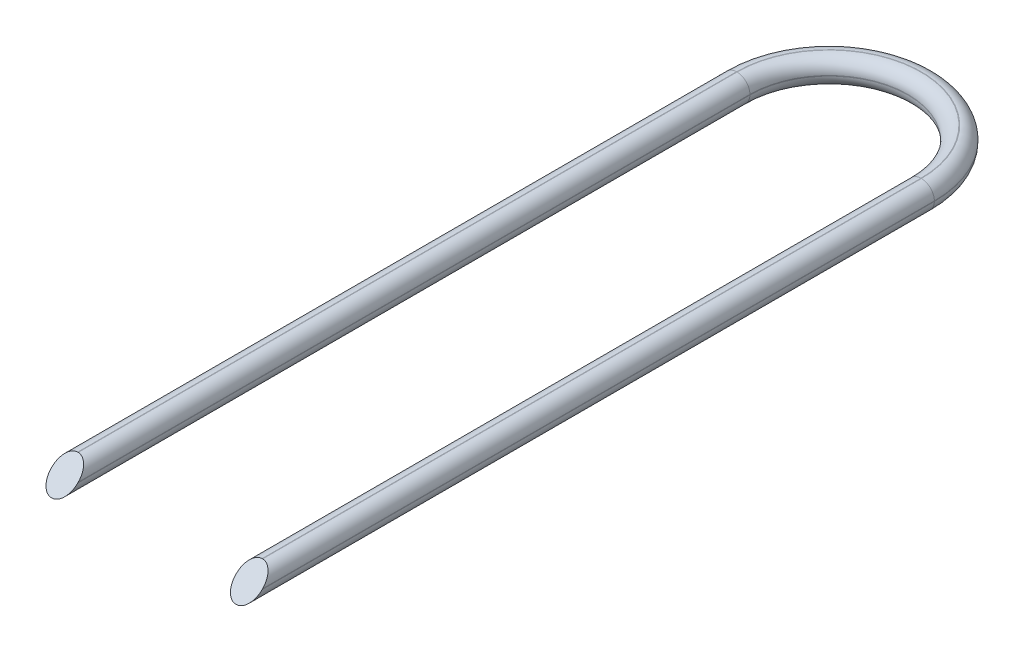
ISO-10303-21;
HEADER;
FILE_DESCRIPTION(('STEP AP214'),'2;1');
FILE_NAME('part.step','',(''),(''),'','','');
FILE_SCHEMA(('AUTOMOTIVE_DESIGN { 1 0 10303 214 1 1 1 1 }'));
ENDSEC;
DATA;
#1=APPLICATION_CONTEXT('core data for automotive mechanical design processes');
#2=APPLICATION_PROTOCOL_DEFINITION('international standard','automotive_design',2000,#1);
#3=PRODUCT_CONTEXT('',#1,'mechanical');
#4=PRODUCT('Part','Part','',(#3));
#5=PRODUCT_RELATED_PRODUCT_CATEGORY('part','',(#4));
#6=PRODUCT_DEFINITION_FORMATION('','',#4);
#7=PRODUCT_DEFINITION_CONTEXT('part definition',#1,'design');
#8=PRODUCT_DEFINITION('design','',#6,#7);
#9=PRODUCT_DEFINITION_SHAPE('','',#8);
#10=(LENGTH_UNIT() NAMED_UNIT(*) SI_UNIT(.MILLI.,.METRE.));
#11=(NAMED_UNIT(*) PLANE_ANGLE_UNIT() SI_UNIT($,.RADIAN.));
#12=(NAMED_UNIT(*) SI_UNIT($,.STERADIAN.) SOLID_ANGLE_UNIT());
#13=UNCERTAINTY_MEASURE_WITH_UNIT(LENGTH_MEASURE(1.E-05),#10,'distance_accuracy_value','');
#14=(GEOMETRIC_REPRESENTATION_CONTEXT(3) GLOBAL_UNCERTAINTY_ASSIGNED_CONTEXT((#13)) GLOBAL_UNIT_ASSIGNED_CONTEXT((#10,
#11,#12)) REPRESENTATION_CONTEXT('',''));
#15=CARTESIAN_POINT('',(0.,0.,0.));
#16=DIRECTION('',(0.,0.,1.));
#17=DIRECTION('',(1.,0.,0.));
#18=AXIS2_PLACEMENT_3D('',#15,#16,#17);
#19=CARTESIAN_POINT('',(18.4463009391175,-1.95817458881617,0.));
#20=DIRECTION('',(1.,0.,0.));
#21=DIRECTION('',(0.,0.,-1.));
#22=AXIS2_PLACEMENT_3D('',#19,#20,#21);
#23=PLANE('',#22);
#24=DIRECTION('',(0.,-0.707106781186548,0.707106781186547));
#25=VECTOR('',#24,1.);
#26=CARTESIAN_POINT('',(18.4463009391175,0.491825411183827,-5.));
#27=LINE('',#26,#25);
#28=CARTESIAN_POINT('',(18.4463009391175,-1.95817458881617,-2.55));
#29=VERTEX_POINT('',#28);
#30=CARTESIAN_POINT('',(18.4463009391175,-2.05817458881617,-2.45));
#31=VERTEX_POINT('',#30);
#32=EDGE_CURVE('E49',#29,#31,#27,.T.);
#33=ORIENTED_EDGE('',*,*,#32,.T.);
#34=DIRECTION('',(0.,0.,-1.));
#35=VECTOR('',#34,1.);
#36=CARTESIAN_POINT('',(18.4463009391175,-2.05817458881617,0.));
#37=LINE('',#36,#35);
#38=CARTESIAN_POINT('',(18.4463009391174,-2.05817458881617,-130.));
#39=VERTEX_POINT('',#38);
#40=EDGE_CURVE('E171',#31,#39,#37,.T.);
#41=ORIENTED_EDGE('',*,*,#40,.T.);
#42=DIRECTION('',(0.,-1.,0.));
#43=VECTOR('',#42,1.);
#44=CARTESIAN_POINT('',(18.4463009391174,-1.95817458881617,-130.));
#45=LINE('',#44,#43);
#46=CARTESIAN_POINT('',(18.4463009391174,-1.95817458881617,-130.));
#47=VERTEX_POINT('',#46);
#48=EDGE_CURVE('E273',#47,#39,#45,.T.);
#49=ORIENTED_EDGE('',*,*,#48,.F.);
#50=DIRECTION('',(0.,0.,-1.));
#51=VECTOR('',#50,1.);
#52=CARTESIAN_POINT('',(18.4463009391175,-1.95817458881617,0.));
#53=LINE('',#52,#51);
#54=EDGE_CURVE('E189',#29,#47,#53,.T.);
#55=ORIENTED_EDGE('',*,*,#54,.F.);
#56=EDGE_LOOP('',(#33,#41,#49,#55));
#57=FACE_BOUND('',#56,.T.);
#58=ADVANCED_FACE('F34',(#57),#23,.T.);
#59=CARTESIAN_POINT('',(15.9963009391175,-2.05817458881617,0.));
#60=DIRECTION('',(0.,0.,-1.));
#61=DIRECTION('',(-1.,0.,0.));
#62=AXIS2_PLACEMENT_3D('',#59,#60,#61);
#63=CYLINDRICAL_SURFACE('',#62,2.45);
#64=CARTESIAN_POINT('',(15.9963009391175,-2.05817458881617,-2.45));
#65=DIRECTION('',(0.,-0.707106781186547,-0.707106781186548));
#66=DIRECTION('',(0.,0.707106781186548,-0.707106781186547));
#67=AXIS2_PLACEMENT_3D('',#64,#65,#66);
#68=ELLIPSE('',#67,3.46482322781408,2.45);
#69=CARTESIAN_POINT('',(15.9963009391175,-4.50817458881617,0.));
#70=VERTEX_POINT('',#69);
#71=EDGE_CURVE('E190',#70,#31,#68,.F.);
#72=ORIENTED_EDGE('',*,*,#71,.F.);
#73=DIRECTION('',(0.,0.,-1.));
#74=VECTOR('',#73,1.);
#75=CARTESIAN_POINT('',(15.9963009391175,-4.50817458881617,0.));
#76=LINE('',#75,#74);
#77=CARTESIAN_POINT('',(15.9963009391174,-4.50817458881617,-130.));
#78=VERTEX_POINT('',#77);
#79=EDGE_CURVE('E170',#70,#78,#76,.T.);
#80=ORIENTED_EDGE('',*,*,#79,.T.);
#81=CARTESIAN_POINT('',(15.9963009391174,-2.05817458881617,-130.));
#82=DIRECTION('',(0.,0.,-1.));
#83=DIRECTION('',(-1.,0.,0.));
#84=AXIS2_PLACEMENT_3D('',#81,#82,#83);
#85=CIRCLE('',#84,2.45);
#86=EDGE_CURVE('E167',#39,#78,#85,.T.);
#87=ORIENTED_EDGE('',*,*,#86,.F.);
#88=ORIENTED_EDGE('',*,*,#40,.F.);
#89=EDGE_LOOP('',(#72,#80,#87,#88));
#90=FACE_BOUND('',#89,.T.);
#91=ADVANCED_FACE('F303',(#90),#63,.T.);
#92=CARTESIAN_POINT('',(15.9963009391175,-4.50817458881617,0.));
#93=DIRECTION('',(0.,-1.,0.));
#94=DIRECTION('',(1.,0.,0.));
#95=AXIS2_PLACEMENT_3D('',#92,#93,#94);
#96=PLANE('',#95);
#97=DIRECTION('',(0.,0.,-1.));
#98=VECTOR('',#97,1.);
#99=CARTESIAN_POINT('',(15.8963009391175,-4.50817458881617,0.));
#100=LINE('',#99,#98);
#101=CARTESIAN_POINT('',(15.8963009391175,-4.50817458881617,0.));
#102=VERTEX_POINT('',#101);
#103=CARTESIAN_POINT('',(15.8963009391174,-4.50817458881617,-130.));
#104=VERTEX_POINT('',#103);
#105=EDGE_CURVE('E193',#102,#104,#100,.T.);
#106=ORIENTED_EDGE('',*,*,#105,.T.);
#107=DIRECTION('',(-1.,0.,0.));
#108=VECTOR('',#107,1.);
#109=CARTESIAN_POINT('',(15.9963009391174,-4.50817458881617,-130.));
#110=LINE('',#109,#108);
#111=EDGE_CURVE('E174',#78,#104,#110,.T.);
#112=ORIENTED_EDGE('',*,*,#111,.F.);
#113=ORIENTED_EDGE('',*,*,#79,.F.);
#114=DIRECTION('',(-1.,0.,0.));
#115=VECTOR('',#114,1.);
#116=CARTESIAN_POINT('',(15.9963009391175,-4.50817458881617,0.));
#117=LINE('',#116,#115);
#118=EDGE_CURVE('E186',#70,#102,#117,.T.);
#119=ORIENTED_EDGE('',*,*,#118,.T.);
#120=EDGE_LOOP('',(#106,#112,#113,#119));
#121=FACE_BOUND('',#120,.T.);
#122=ADVANCED_FACE('F328',(#121),#96,.T.);
#123=CARTESIAN_POINT('',(15.8963009391175,-2.05817458881617,0.));
#124=DIRECTION('',(0.,0.,-1.));
#125=DIRECTION('',(-1.,0.,0.));
#126=AXIS2_PLACEMENT_3D('',#123,#124,#125);
#127=CYLINDRICAL_SURFACE('',#126,2.45);
#128=CARTESIAN_POINT('',(15.8963009391175,-2.05817458881617,-2.45));
#129=DIRECTION('',(0.,-0.707106781186547,-0.707106781186548));
#130=DIRECTION('',(0.,0.707106781186548,-0.707106781186547));
#131=AXIS2_PLACEMENT_3D('',#128,#129,#130);
#132=ELLIPSE('',#131,3.46482322781408,2.45);
#133=CARTESIAN_POINT('',(13.4463009391175,-2.05817458881617,-2.45));
#134=VERTEX_POINT('',#133);
#135=EDGE_CURVE('E278',#134,#102,#132,.F.);
#136=ORIENTED_EDGE('',*,*,#135,.F.);
#137=DIRECTION('',(0.,0.,-1.));
#138=VECTOR('',#137,1.);
#139=CARTESIAN_POINT('',(13.4463009391175,-2.05817458881617,0.));
#140=LINE('',#139,#138);
#141=CARTESIAN_POINT('',(13.4463009391175,-2.05817458881617,-130.));
#142=VERTEX_POINT('',#141);
#143=EDGE_CURVE('E210',#134,#142,#140,.T.);
#144=ORIENTED_EDGE('',*,*,#143,.T.);
#145=CARTESIAN_POINT('',(15.8963009391174,-2.05817458881617,-130.));
#146=DIRECTION('',(0.,0.,-1.));
#147=DIRECTION('',(-1.,0.,0.));
#148=AXIS2_PLACEMENT_3D('',#145,#146,#147);
#149=CIRCLE('',#148,2.45);
#150=EDGE_CURVE('E196',#104,#142,#149,.T.);
#151=ORIENTED_EDGE('',*,*,#150,.F.);
#152=ORIENTED_EDGE('',*,*,#105,.F.);
#153=EDGE_LOOP('',(#136,#144,#151,#152));
#154=FACE_BOUND('',#153,.T.);
#155=ADVANCED_FACE('F332',(#154),#127,.T.);
#156=CARTESIAN_POINT('',(13.4463009391175,-1.95817458881617,0.));
#157=DIRECTION('',(-1.,0.,0.));
#158=DIRECTION('',(0.,0.,1.));
#159=AXIS2_PLACEMENT_3D('',#156,#157,#158);
#160=PLANE('',#159);
#161=DIRECTION('',(0.,-0.707106781186548,0.707106781186547));
#162=VECTOR('',#161,1.);
#163=CARTESIAN_POINT('',(13.4463009391175,-3.23317458881617,-1.275));
#164=LINE('',#163,#162);
#165=CARTESIAN_POINT('',(13.4463009391175,-1.95817458881617,-2.55));
#166=VERTEX_POINT('',#165);
#167=EDGE_CURVE('E280',#166,#134,#164,.T.);
#168=ORIENTED_EDGE('',*,*,#167,.F.);
#169=DIRECTION('',(0.,0.,-1.));
#170=VECTOR('',#169,1.);
#171=CARTESIAN_POINT('',(13.4463009391175,-1.95817458881617,0.));
#172=LINE('',#171,#170);
#173=CARTESIAN_POINT('',(13.4463009391174,-1.95817458881617,-130.));
#174=VERTEX_POINT('',#173);
#175=EDGE_CURVE('E224',#166,#174,#172,.T.);
#176=ORIENTED_EDGE('',*,*,#175,.T.);
#177=DIRECTION('',(0.,1.,0.));
#178=VECTOR('',#177,1.);
#179=CARTESIAN_POINT('',(13.4463009391175,-1.95817458881617,-130.));
#180=LINE('',#179,#178);
#181=EDGE_CURVE('E212',#142,#174,#180,.T.);
#182=ORIENTED_EDGE('',*,*,#181,.F.);
#183=ORIENTED_EDGE('',*,*,#143,.F.);
#184=EDGE_LOOP('',(#168,#176,#182,#183));
#185=FACE_BOUND('',#184,.T.);
#186=ADVANCED_FACE('F340',(#185),#160,.T.);
#187=CARTESIAN_POINT('',(15.8963009391175,-1.95817458881617,0.));
#188=DIRECTION('',(0.,0.,-1.));
#189=DIRECTION('',(-1.,0.,0.));
#190=AXIS2_PLACEMENT_3D('',#187,#188,#189);
#191=CYLINDRICAL_SURFACE('',#190,2.45);
#192=CARTESIAN_POINT('',(15.8963009391175,-1.95817458881617,-2.55));
#193=DIRECTION('',(0.,-0.707106781186547,-0.707106781186548));
#194=DIRECTION('',(0.,0.707106781186548,-0.707106781186547));
#195=AXIS2_PLACEMENT_3D('',#192,#193,#194);
#196=ELLIPSE('',#195,3.46482322781408,2.45);
#197=CARTESIAN_POINT('',(15.8963009391174,0.491825411183827,-5.));
#198=VERTEX_POINT('',#197);
#199=EDGE_CURVE('E282',#198,#166,#196,.F.);
#200=ORIENTED_EDGE('',*,*,#199,.F.);
#201=DIRECTION('',(0.,0.,-1.));
#202=VECTOR('',#201,1.);
#203=CARTESIAN_POINT('',(15.8963009391175,0.491825411183827,0.));
#204=LINE('',#203,#202);
#205=CARTESIAN_POINT('',(15.8963009391174,0.491825411183827,-130.));
#206=VERTEX_POINT('',#205);
#207=EDGE_CURVE('E238',#198,#206,#204,.T.);
#208=ORIENTED_EDGE('',*,*,#207,.T.);
#209=CARTESIAN_POINT('',(15.8963009391174,-1.95817458881617,-130.));
#210=DIRECTION('',(0.,0.,-1.));
#211=DIRECTION('',(-1.,0.,0.));
#212=AXIS2_PLACEMENT_3D('',#209,#210,#211);
#213=CIRCLE('',#212,2.45);
#214=EDGE_CURVE('E226',#174,#206,#213,.T.);
#215=ORIENTED_EDGE('',*,*,#214,.F.);
#216=ORIENTED_EDGE('',*,*,#175,.F.);
#217=EDGE_LOOP('',(#200,#208,#215,#216));
#218=FACE_BOUND('',#217,.T.);
#219=ADVANCED_FACE('F349',(#218),#191,.T.);
#220=CARTESIAN_POINT('',(15.9963009391175,0.491825411183827,0.));
#221=DIRECTION('',(0.,1.,0.));
#222=DIRECTION('',(0.,0.,1.));
#223=AXIS2_PLACEMENT_3D('',#220,#221,#222);
#224=PLANE('',#223);
#225=DIRECTION('',(-1.,0.,0.));
#226=VECTOR('',#225,1.);
#227=CARTESIAN_POINT('',(18.4463009391175,0.491825411183827,-5.));
#228=LINE('',#227,#226);
#229=CARTESIAN_POINT('',(15.9963009391175,0.491825411183827,-5.));
#230=VERTEX_POINT('',#229);
#231=EDGE_CURVE('E294',#230,#198,#228,.T.);
#232=ORIENTED_EDGE('',*,*,#231,.F.);
#233=DIRECTION('',(0.,0.,-1.));
#234=VECTOR('',#233,1.);
#235=CARTESIAN_POINT('',(15.9963009391175,0.491825411183827,0.));
#236=LINE('',#235,#234);
#237=CARTESIAN_POINT('',(15.9963009391174,0.491825411183827,-130.));
#238=VERTEX_POINT('',#237);
#239=EDGE_CURVE('E251',#230,#238,#236,.T.);
#240=ORIENTED_EDGE('',*,*,#239,.T.);
#241=DIRECTION('',(1.,0.,0.));
#242=VECTOR('',#241,1.);
#243=CARTESIAN_POINT('',(15.9963009391174,0.491825411183827,-130.));
#244=LINE('',#243,#242);
#245=EDGE_CURVE('E240',#206,#238,#244,.T.);
#246=ORIENTED_EDGE('',*,*,#245,.F.);
#247=ORIENTED_EDGE('',*,*,#207,.F.);
#248=EDGE_LOOP('',(#232,#240,#246,#247));
#249=FACE_BOUND('',#248,.T.);
#250=ADVANCED_FACE('F358',(#249),#224,.T.);
#251=CARTESIAN_POINT('',(15.9963009391175,-1.95817458881617,0.));
#252=DIRECTION('',(0.,0.,-1.));
#253=DIRECTION('',(-1.,0.,0.));
#254=AXIS2_PLACEMENT_3D('',#251,#252,#253);
#255=CYLINDRICAL_SURFACE('',#254,2.45);
#256=CARTESIAN_POINT('',(15.9963009391175,-1.95817458881617,-2.55));
#257=DIRECTION('',(0.,-0.707106781186547,-0.707106781186548));
#258=DIRECTION('',(0.,0.707106781186548,-0.707106781186547));
#259=AXIS2_PLACEMENT_3D('',#256,#257,#258);
#260=ELLIPSE('',#259,3.46482322781408,2.45);
#261=EDGE_CURVE('E284',#29,#230,#260,.F.);
#262=ORIENTED_EDGE('',*,*,#261,.F.);
#263=ORIENTED_EDGE('',*,*,#54,.T.);
#264=CARTESIAN_POINT('',(15.9963009391174,-1.95817458881617,-130.));
#265=DIRECTION('',(0.,0.,-1.));
#266=DIRECTION('',(1.,0.,0.));
#267=AXIS2_PLACEMENT_3D('',#264,#265,#266);
#268=CIRCLE('',#267,2.45);
#269=EDGE_CURVE('E253',#238,#47,#268,.T.);
#270=ORIENTED_EDGE('',*,*,#269,.F.);
#271=ORIENTED_EDGE('',*,*,#239,.F.);
#272=EDGE_LOOP('',(#262,#263,#270,#271));
#273=FACE_BOUND('',#272,.T.);
#274=ADVANCED_FACE('F362',(#273),#255,.T.);
#275=CARTESIAN_POINT('',(-1.55369906088255,0.,-130.));
#276=DIRECTION('',(0.,1.,0.));
#277=DIRECTION('',(0.,0.,1.));
#278=AXIS2_PLACEMENT_3D('',#275,#276,#277);
#279=CYLINDRICAL_SURFACE('',#278,20.);
#280=CARTESIAN_POINT('',(-1.55369906088255,-2.05817458881617,-130.));
#281=DIRECTION('',(0.,1.,0.));
#282=DIRECTION('',(1.,0.,0.));
#283=AXIS2_PLACEMENT_3D('',#280,#281,#282);
#284=CIRCLE('',#283,20.);
#285=CARTESIAN_POINT('',(-21.5536990608825,-2.05817458881617,-130.));
#286=VERTEX_POINT('',#285);
#287=EDGE_CURVE('E179',#39,#286,#284,.T.);
#288=ORIENTED_EDGE('',*,*,#287,.T.);
#289=DIRECTION('',(0.,-1.,0.));
#290=VECTOR('',#289,1.);
#291=CARTESIAN_POINT('',(-21.5536990608825,-1.95817458881617,-130.));
#292=LINE('',#291,#290);
#293=CARTESIAN_POINT('',(-21.5536990608825,-1.95817458881617,-130.));
#294=VERTEX_POINT('',#293);
#295=EDGE_CURVE('E266',#294,#286,#292,.T.);
#296=ORIENTED_EDGE('',*,*,#295,.F.);
#297=CARTESIAN_POINT('',(-1.55369906088255,-1.95817458881617,-130.));
#298=DIRECTION('',(0.,1.,0.));
#299=DIRECTION('',(1.,0.,0.));
#300=AXIS2_PLACEMENT_3D('',#297,#298,#299);
#301=CIRCLE('',#300,20.);
#302=EDGE_CURVE('E260',#47,#294,#301,.T.);
#303=ORIENTED_EDGE('',*,*,#302,.F.);
#304=ORIENTED_EDGE('',*,*,#48,.T.);
#305=EDGE_LOOP('',(#288,#296,#303,#304));
#306=FACE_BOUND('',#305,.T.);
#307=ADVANCED_FACE('F307',(#306),#279,.T.);
#308=CARTESIAN_POINT('',(-1.55369906088255,-2.05817458881617,-130.));
#309=DIRECTION('',(0.,1.,0.));
#310=DIRECTION('',(0.,0.,1.));
#311=AXIS2_PLACEMENT_3D('',#308,#309,#310);
#312=TOROIDAL_SURFACE('',#311,17.55,2.45);
#313=CARTESIAN_POINT('',(-1.55369906088255,-4.50817458881617,-130.));
#314=DIRECTION('',(0.,1.,0.));
#315=DIRECTION('',(1.,0.,0.));
#316=AXIS2_PLACEMENT_3D('',#313,#314,#315);
#317=CIRCLE('',#316,17.55);
#318=CARTESIAN_POINT('',(-19.1036990608825,-4.50817458881617,-130.));
#319=VERTEX_POINT('',#318);
#320=EDGE_CURVE('E178',#78,#319,#317,.T.);
#321=ORIENTED_EDGE('',*,*,#320,.T.);
#322=CARTESIAN_POINT('',(-19.1036990608825,-2.05817458881617,-130.));
#323=DIRECTION('',(0.,0.,1.));
#324=DIRECTION('',(1.,0.,0.));
#325=AXIS2_PLACEMENT_3D('',#322,#323,#324);
#326=CIRCLE('',#325,2.45);
#327=EDGE_CURVE('E175',#286,#319,#326,.T.);
#328=ORIENTED_EDGE('',*,*,#327,.F.);
#329=ORIENTED_EDGE('',*,*,#287,.F.);
#330=ORIENTED_EDGE('',*,*,#86,.T.);
#331=EDGE_LOOP('',(#321,#328,#329,#330));
#332=FACE_BOUND('',#331,.T.);
#333=ADVANCED_FACE('F309',(#332),#312,.T.);
#334=CARTESIAN_POINT('',(15.9963009391174,-4.50817458881617,-130.));
#335=DIRECTION('',(0.,-1.,0.));
#336=DIRECTION('',(0.,0.,-1.));
#337=AXIS2_PLACEMENT_3D('',#334,#335,#336);
#338=PLANE('',#337);
#339=CARTESIAN_POINT('',(-1.55369906088255,-4.50817458881617,-130.));
#340=DIRECTION('',(0.,1.,0.));
#341=DIRECTION('',(1.,0.,0.));
#342=AXIS2_PLACEMENT_3D('',#339,#340,#341);
#343=CIRCLE('',#342,17.45);
#344=CARTESIAN_POINT('',(-19.0036990608825,-4.50817458881617,-130.));
#345=VERTEX_POINT('',#344);
#346=EDGE_CURVE('E199',#104,#345,#343,.T.);
#347=ORIENTED_EDGE('',*,*,#346,.T.);
#348=DIRECTION('',(1.,0.,0.));
#349=VECTOR('',#348,1.);
#350=CARTESIAN_POINT('',(-19.1036990608825,-4.50817458881617,-130.));
#351=LINE('',#350,#349);
#352=EDGE_CURVE('E182',#319,#345,#351,.T.);
#353=ORIENTED_EDGE('',*,*,#352,.F.);
#354=ORIENTED_EDGE('',*,*,#320,.F.);
#355=ORIENTED_EDGE('',*,*,#111,.T.);
#356=EDGE_LOOP('',(#347,#353,#354,#355));
#357=FACE_BOUND('',#356,.T.);
#358=ADVANCED_FACE('F325',(#357),#338,.T.);
#359=CARTESIAN_POINT('',(-1.55369906088255,-2.05817458881617,-130.));
#360=DIRECTION('',(0.,1.,0.));
#361=DIRECTION('',(0.,0.,1.));
#362=AXIS2_PLACEMENT_3D('',#359,#360,#361);
#363=TOROIDAL_SURFACE('',#362,17.45,2.45);
#364=CARTESIAN_POINT('',(-1.55369906088255,-2.05817458881617,-130.));
#365=DIRECTION('',(0.,1.,0.));
#366=DIRECTION('',(1.,0.,0.));
#367=AXIS2_PLACEMENT_3D('',#364,#365,#366);
#368=CIRCLE('',#367,15.);
#369=CARTESIAN_POINT('',(-16.5536990608825,-2.05817458881617,-130.));
#370=VERTEX_POINT('',#369);
#371=EDGE_CURVE('E215',#142,#370,#368,.T.);
#372=ORIENTED_EDGE('',*,*,#371,.T.);
#373=CARTESIAN_POINT('',(-19.0036990608825,-2.05817458881617,-130.));
#374=DIRECTION('',(0.,0.,1.));
#375=DIRECTION('',(1.,0.,0.));
#376=AXIS2_PLACEMENT_3D('',#373,#374,#375);
#377=CIRCLE('',#376,2.45);
#378=EDGE_CURVE('E202',#345,#370,#377,.T.);
#379=ORIENTED_EDGE('',*,*,#378,.F.);
#380=ORIENTED_EDGE('',*,*,#346,.F.);
#381=ORIENTED_EDGE('',*,*,#150,.T.);
#382=EDGE_LOOP('',(#372,#379,#380,#381));
#383=FACE_BOUND('',#382,.T.);
#384=ADVANCED_FACE('F321',(#383),#363,.T.);
#385=CARTESIAN_POINT('',(-1.55369906088255,0.,-130.));
#386=DIRECTION('',(0.,1.,0.));
#387=DIRECTION('',(0.,0.,1.));
#388=AXIS2_PLACEMENT_3D('',#385,#386,#387);
#389=CYLINDRICAL_SURFACE('',#388,15.);
#390=CARTESIAN_POINT('',(-1.55369906088255,-1.95817458881617,-130.));
#391=DIRECTION('',(0.,1.,0.));
#392=DIRECTION('',(1.,0.,0.));
#393=AXIS2_PLACEMENT_3D('',#390,#391,#392);
#394=CIRCLE('',#393,15.);
#395=CARTESIAN_POINT('',(-16.5536990608825,-1.95817458881617,-130.));
#396=VERTEX_POINT('',#395);
#397=EDGE_CURVE('E229',#174,#396,#394,.T.);
#398=ORIENTED_EDGE('',*,*,#397,.T.);
#399=DIRECTION('',(0.,1.,0.));
#400=VECTOR('',#399,1.);
#401=CARTESIAN_POINT('',(-16.5536990608825,-1.95817458881617,-130.));
#402=LINE('',#401,#400);
#403=EDGE_CURVE('E218',#370,#396,#402,.T.);
#404=ORIENTED_EDGE('',*,*,#403,.F.);
#405=ORIENTED_EDGE('',*,*,#371,.F.);
#406=ORIENTED_EDGE('',*,*,#181,.T.);
#407=EDGE_LOOP('',(#398,#404,#405,#406));
#408=FACE_BOUND('',#407,.T.);
#409=ADVANCED_FACE('F339',(#408),#389,.F.);
#410=CARTESIAN_POINT('',(-1.55369906088255,-1.95817458881617,-130.));
#411=DIRECTION('',(0.,1.,0.));
#412=DIRECTION('',(0.,0.,1.));
#413=AXIS2_PLACEMENT_3D('',#410,#411,#412);
#414=TOROIDAL_SURFACE('',#413,17.45,2.45);
#415=CARTESIAN_POINT('',(-1.55369906088255,0.491825411183827,-130.));
#416=DIRECTION('',(0.,1.,0.));
#417=DIRECTION('',(1.,0.,0.));
#418=AXIS2_PLACEMENT_3D('',#415,#416,#417);
#419=CIRCLE('',#418,17.45);
#420=CARTESIAN_POINT('',(-19.0036990608825,0.491825411183827,-130.));
#421=VERTEX_POINT('',#420);
#422=EDGE_CURVE('E243',#206,#421,#419,.T.);
#423=ORIENTED_EDGE('',*,*,#422,.T.);
#424=CARTESIAN_POINT('',(-19.0036990608825,-1.95817458881617,-130.));
#425=DIRECTION('',(0.,0.,1.));
#426=DIRECTION('',(1.,0.,0.));
#427=AXIS2_PLACEMENT_3D('',#424,#425,#426);
#428=CIRCLE('',#427,2.45);
#429=EDGE_CURVE('E232',#396,#421,#428,.T.);
#430=ORIENTED_EDGE('',*,*,#429,.F.);
#431=ORIENTED_EDGE('',*,*,#397,.F.);
#432=ORIENTED_EDGE('',*,*,#214,.T.);
#433=EDGE_LOOP('',(#423,#430,#431,#432));
#434=FACE_BOUND('',#433,.T.);
#435=ADVANCED_FACE('F348',(#434),#414,.T.);
#436=CARTESIAN_POINT('',(15.9963009391174,0.491825411183827,-130.));
#437=DIRECTION('',(0.,1.,0.));
#438=DIRECTION('',(0.,0.,1.));
#439=AXIS2_PLACEMENT_3D('',#436,#437,#438);
#440=PLANE('',#439);
#441=CARTESIAN_POINT('',(-1.55369906088255,0.491825411183827,-130.));
#442=DIRECTION('',(0.,1.,0.));
#443=DIRECTION('',(1.,0.,0.));
#444=AXIS2_PLACEMENT_3D('',#441,#442,#443);
#445=CIRCLE('',#444,17.55);
#446=CARTESIAN_POINT('',(-19.1036990608825,0.491825411183827,-130.));
#447=VERTEX_POINT('',#446);
#448=EDGE_CURVE('E164',#238,#447,#445,.T.);
#449=ORIENTED_EDGE('',*,*,#448,.T.);
#450=DIRECTION('',(-1.,0.,0.));
#451=VECTOR('',#450,1.);
#452=CARTESIAN_POINT('',(-19.1036990608825,0.491825411183827,-130.));
#453=LINE('',#452,#451);
#454=EDGE_CURVE('E246',#421,#447,#453,.T.);
#455=ORIENTED_EDGE('',*,*,#454,.F.);
#456=ORIENTED_EDGE('',*,*,#422,.F.);
#457=ORIENTED_EDGE('',*,*,#245,.T.);
#458=EDGE_LOOP('',(#449,#455,#456,#457));
#459=FACE_BOUND('',#458,.T.);
#460=ADVANCED_FACE('F357',(#459),#440,.T.);
#461=CARTESIAN_POINT('',(-1.55369906088255,-1.95817458881617,-130.));
#462=DIRECTION('',(0.,1.,0.));
#463=DIRECTION('',(0.,0.,1.));
#464=AXIS2_PLACEMENT_3D('',#461,#462,#463);
#465=TOROIDAL_SURFACE('',#464,17.55,2.45);
#466=CARTESIAN_POINT('',(-19.1036990608825,-1.95817458881617,-130.));
#467=DIRECTION('',(0.,0.,1.));
#468=DIRECTION('',(-1.,0.,0.));
#469=AXIS2_PLACEMENT_3D('',#466,#467,#468);
#470=CIRCLE('',#469,2.45);
#471=EDGE_CURVE('E159',#447,#294,#470,.T.);
#472=ORIENTED_EDGE('',*,*,#471,.F.);
#473=ORIENTED_EDGE('',*,*,#448,.F.);
#474=ORIENTED_EDGE('',*,*,#269,.T.);
#475=ORIENTED_EDGE('',*,*,#302,.T.);
#476=EDGE_LOOP('',(#472,#473,#474,#475));
#477=FACE_BOUND('',#476,.T.);
#478=ADVANCED_FACE('F361',(#477),#465,.T.);
#479=CARTESIAN_POINT('',(-21.5536990608825,-1.95817458881617,-130.));
#480=DIRECTION('',(-1.,0.,0.));
#481=DIRECTION('',(0.,0.,1.));
#482=AXIS2_PLACEMENT_3D('',#479,#480,#481);
#483=PLANE('',#482);
#484=DIRECTION('',(0.,-0.707106781186548,0.707106781186547));
#485=VECTOR('',#484,1.);
#486=CARTESIAN_POINT('',(-21.5536990608825,0.491825411183827,-5.));
#487=LINE('',#486,#485);
#488=CARTESIAN_POINT('',(-21.5536990608825,-1.95817458881617,-2.55));
#489=VERTEX_POINT('',#488);
#490=CARTESIAN_POINT('',(-21.5536990608825,-2.05817458881618,-2.45));
#491=VERTEX_POINT('',#490);
#492=EDGE_CURVE('E145',#489,#491,#487,.T.);
#493=ORIENTED_EDGE('',*,*,#492,.F.);
#494=DIRECTION('',(0.,0.,1.));
#495=VECTOR('',#494,1.);
#496=CARTESIAN_POINT('',(-21.5536990608825,-1.95817458881617,-130.));
#497=LINE('',#496,#495);
#498=EDGE_CURVE('E154',#294,#489,#497,.T.);
#499=ORIENTED_EDGE('',*,*,#498,.F.);
#500=ORIENTED_EDGE('',*,*,#295,.T.);
#501=DIRECTION('',(0.,0.,1.));
#502=VECTOR('',#501,1.);
#503=CARTESIAN_POINT('',(-21.5536990608825,-2.05817458881617,-130.));
#504=LINE('',#503,#502);
#505=EDGE_CURVE('E156',#286,#491,#504,.T.);
#506=ORIENTED_EDGE('',*,*,#505,.T.);
#507=EDGE_LOOP('',(#493,#499,#500,#506));
#508=FACE_BOUND('',#507,.T.);
#509=ADVANCED_FACE('F152',(#508),#483,.T.);
#510=CARTESIAN_POINT('',(-19.1036990608825,-2.05817458881617,-130.));
#511=DIRECTION('',(0.,0.,1.));
#512=DIRECTION('',(1.,0.,0.));
#513=AXIS2_PLACEMENT_3D('',#510,#511,#512);
#514=CYLINDRICAL_SURFACE('',#513,2.45);
#515=CARTESIAN_POINT('',(-19.1036990608825,-2.05817458881617,-2.45000000000001));
#516=DIRECTION('',(0.,-0.707106781186547,-0.707106781186548));
#517=DIRECTION('',(0.,-0.707106781186548,0.707106781186547));
#518=AXIS2_PLACEMENT_3D('',#515,#516,#517);
#519=ELLIPSE('',#518,3.46482322781408,2.45);
#520=CARTESIAN_POINT('',(-19.1036990608825,-4.50817458881617,0.));
#521=VERTEX_POINT('',#520);
#522=EDGE_CURVE('E286',#491,#521,#519,.F.);
#523=ORIENTED_EDGE('',*,*,#522,.F.);
#524=ORIENTED_EDGE('',*,*,#505,.F.);
#525=ORIENTED_EDGE('',*,*,#327,.T.);
#526=DIRECTION('',(0.,0.,1.));
#527=VECTOR('',#526,1.);
#528=CARTESIAN_POINT('',(-19.1036990608825,-4.50817458881617,-130.));
#529=LINE('',#528,#527);
#530=EDGE_CURVE('E162',#319,#521,#529,.T.);
#531=ORIENTED_EDGE('',*,*,#530,.T.);
#532=EDGE_LOOP('',(#523,#524,#525,#531));
#533=FACE_BOUND('',#532,.T.);
#534=ADVANCED_FACE('F311',(#533),#514,.T.);
#535=CARTESIAN_POINT('',(-19.1036990608825,-4.50817458881617,-130.));
#536=DIRECTION('',(0.,-1.,0.));
#537=DIRECTION('',(1.,0.,0.));
#538=AXIS2_PLACEMENT_3D('',#535,#536,#537);
#539=PLANE('',#538);
#540=DIRECTION('',(0.,0.,1.));
#541=VECTOR('',#540,1.);
#542=CARTESIAN_POINT('',(-19.0036990608825,-4.50817458881617,-130.));
#543=LINE('',#542,#541);
#544=CARTESIAN_POINT('',(-19.0036990608825,-4.50817458881617,0.));
#545=VERTEX_POINT('',#544);
#546=EDGE_CURVE('E204',#345,#545,#543,.T.);
#547=ORIENTED_EDGE('',*,*,#546,.T.);
#548=DIRECTION('',(1.,0.,0.));
#549=VECTOR('',#548,1.);
#550=CARTESIAN_POINT('',(-19.1036990608825,-4.50817458881617,0.));
#551=LINE('',#550,#549);
#552=EDGE_CURVE('E185',#521,#545,#551,.T.);
#553=ORIENTED_EDGE('',*,*,#552,.F.);
#554=ORIENTED_EDGE('',*,*,#530,.F.);
#555=ORIENTED_EDGE('',*,*,#352,.T.);
#556=EDGE_LOOP('',(#547,#553,#554,#555));
#557=FACE_BOUND('',#556,.T.);
#558=ADVANCED_FACE('F315',(#557),#539,.T.);
#559=CARTESIAN_POINT('',(-19.0036990608825,-2.05817458881617,-130.));
#560=DIRECTION('',(0.,0.,1.));
#561=DIRECTION('',(1.,0.,0.));
#562=AXIS2_PLACEMENT_3D('',#559,#560,#561);
#563=CYLINDRICAL_SURFACE('',#562,2.45);
#564=CARTESIAN_POINT('',(-19.0036990608825,-2.05817458881617,-2.45000000000001));
#565=DIRECTION('',(0.,-0.707106781186547,-0.707106781186548));
#566=DIRECTION('',(0.,-0.707106781186548,0.707106781186547));
#567=AXIS2_PLACEMENT_3D('',#564,#565,#566);
#568=ELLIPSE('',#567,3.46482322781408,2.45);
#569=CARTESIAN_POINT('',(-16.5536990608825,-2.05817458881617,-2.45000000000001));
#570=VERTEX_POINT('',#569);
#571=EDGE_CURVE('E288',#545,#570,#568,.F.);
#572=ORIENTED_EDGE('',*,*,#571,.F.);
#573=ORIENTED_EDGE('',*,*,#546,.F.);
#574=ORIENTED_EDGE('',*,*,#378,.T.);
#575=DIRECTION('',(0.,0.,1.));
#576=VECTOR('',#575,1.);
#577=CARTESIAN_POINT('',(-16.5536990608825,-2.05817458881617,-130.));
#578=LINE('',#577,#576);
#579=EDGE_CURVE('E207',#370,#570,#578,.T.);
#580=ORIENTED_EDGE('',*,*,#579,.T.);
#581=EDGE_LOOP('',(#572,#573,#574,#580));
#582=FACE_BOUND('',#581,.T.);
#583=ADVANCED_FACE('F319',(#582),#563,.T.);
#584=CARTESIAN_POINT('',(-16.5536990608825,-1.95817458881617,-130.));
#585=DIRECTION('',(1.,0.,0.));
#586=DIRECTION('',(0.,0.,-1.));
#587=AXIS2_PLACEMENT_3D('',#584,#585,#586);
#588=PLANE('',#587);
#589=DIRECTION('',(0.,0.707106781186548,-0.707106781186547));
#590=VECTOR('',#589,1.);
#591=CARTESIAN_POINT('',(-16.5536990608825,61.7668254111838,-66.275));
#592=LINE('',#591,#590);
#593=CARTESIAN_POINT('',(-16.5536990608825,-1.95817458881617,-2.55));
#594=VERTEX_POINT('',#593);
#595=EDGE_CURVE('E290',#570,#594,#592,.T.);
#596=ORIENTED_EDGE('',*,*,#595,.F.);
#597=ORIENTED_EDGE('',*,*,#579,.F.);
#598=ORIENTED_EDGE('',*,*,#403,.T.);
#599=DIRECTION('',(0.,0.,1.));
#600=VECTOR('',#599,1.);
#601=CARTESIAN_POINT('',(-16.5536990608825,-1.95817458881617,-130.));
#602=LINE('',#601,#600);
#603=EDGE_CURVE('E221',#396,#594,#602,.T.);
#604=ORIENTED_EDGE('',*,*,#603,.T.);
#605=EDGE_LOOP('',(#596,#597,#598,#604));
#606=FACE_BOUND('',#605,.T.);
#607=ADVANCED_FACE('F381',(#606),#588,.T.);
#608=CARTESIAN_POINT('',(-19.0036990608825,-1.95817458881617,-130.));
#609=DIRECTION('',(0.,0.,1.));
#610=DIRECTION('',(1.,0.,0.));
#611=AXIS2_PLACEMENT_3D('',#608,#609,#610);
#612=CYLINDRICAL_SURFACE('',#611,2.45);
#613=CARTESIAN_POINT('',(-19.0036990608825,-1.95817458881617,-2.55));
#614=DIRECTION('',(0.,-0.707106781186547,-0.707106781186548));
#615=DIRECTION('',(0.,-0.707106781186548,0.707106781186547));
#616=AXIS2_PLACEMENT_3D('',#613,#614,#615);
#617=ELLIPSE('',#616,3.46482322781408,2.45);
#618=CARTESIAN_POINT('',(-19.0036990608825,0.491825411183827,-5.));
#619=VERTEX_POINT('',#618);
#620=EDGE_CURVE('E292',#594,#619,#617,.F.);
#621=ORIENTED_EDGE('',*,*,#620,.F.);
#622=ORIENTED_EDGE('',*,*,#603,.F.);
#623=ORIENTED_EDGE('',*,*,#429,.T.);
#624=DIRECTION('',(0.,0.,1.));
#625=VECTOR('',#624,1.);
#626=CARTESIAN_POINT('',(-19.0036990608825,0.491825411183827,-130.));
#627=LINE('',#626,#625);
#628=EDGE_CURVE('E235',#421,#619,#627,.T.);
#629=ORIENTED_EDGE('',*,*,#628,.T.);
#630=EDGE_LOOP('',(#621,#622,#623,#629));
#631=FACE_BOUND('',#630,.T.);
#632=ADVANCED_FACE('F375',(#631),#612,.T.);
#633=CARTESIAN_POINT('',(-19.1036990608825,0.491825411183827,-130.));
#634=DIRECTION('',(0.,1.,0.));
#635=DIRECTION('',(0.,0.,1.));
#636=AXIS2_PLACEMENT_3D('',#633,#634,#635);
#637=PLANE('',#636);
#638=CARTESIAN_POINT('',(-19.1036990608825,0.491825411183827,-5.));
#639=VERTEX_POINT('',#638);
#640=EDGE_CURVE('E56',#619,#639,#228,.T.);
#641=ORIENTED_EDGE('',*,*,#640,.F.);
#642=ORIENTED_EDGE('',*,*,#628,.F.);
#643=ORIENTED_EDGE('',*,*,#454,.T.);
#644=DIRECTION('',(0.,0.,1.));
#645=VECTOR('',#644,1.);
#646=CARTESIAN_POINT('',(-19.1036990608825,0.491825411183827,-130.));
#647=LINE('',#646,#645);
#648=EDGE_CURVE('E42',#447,#639,#647,.T.);
#649=ORIENTED_EDGE('',*,*,#648,.T.);
#650=EDGE_LOOP('',(#641,#642,#643,#649));
#651=FACE_BOUND('',#650,.T.);
#652=ADVANCED_FACE('F371',(#651),#637,.T.);
#653=CARTESIAN_POINT('',(-19.1036990608825,-1.95817458881617,-130.));
#654=DIRECTION('',(0.,0.,1.));
#655=DIRECTION('',(1.,0.,0.));
#656=AXIS2_PLACEMENT_3D('',#653,#654,#655);
#657=CYLINDRICAL_SURFACE('',#656,2.45);
#658=CARTESIAN_POINT('',(-19.1036990608825,-1.95817458881617,-2.55));
#659=DIRECTION('',(0.,-0.707106781186547,-0.707106781186548));
#660=DIRECTION('',(0.,-0.707106781186548,0.707106781186547));
#661=AXIS2_PLACEMENT_3D('',#658,#659,#660);
#662=ELLIPSE('',#661,3.46482322781408,2.45);
#663=EDGE_CURVE('E11',#639,#489,#662,.F.);
#664=ORIENTED_EDGE('',*,*,#663,.F.);
#665=ORIENTED_EDGE('',*,*,#648,.F.);
#666=ORIENTED_EDGE('',*,*,#471,.T.);
#667=ORIENTED_EDGE('',*,*,#498,.T.);
#668=EDGE_LOOP('',(#664,#665,#666,#667));
#669=FACE_BOUND('',#668,.T.);
#670=ADVANCED_FACE('F36',(#669),#657,.T.);
#671=CARTESIAN_POINT('',(18.4463009391175,0.491825411183827,-5.));
#672=DIRECTION('',(0.,-0.707106781186547,-0.707106781186548));
#673=DIRECTION('',(0.,0.707106781186548,-0.707106781186547));
#674=AXIS2_PLACEMENT_3D('',#671,#672,#673);
#675=PLANE('',#674);
#676=ORIENTED_EDGE('',*,*,#522,.T.);
#677=ORIENTED_EDGE('',*,*,#552,.T.);
#678=ORIENTED_EDGE('',*,*,#571,.T.);
#679=ORIENTED_EDGE('',*,*,#595,.T.);
#680=ORIENTED_EDGE('',*,*,#620,.T.);
#681=ORIENTED_EDGE('',*,*,#640,.T.);
#682=ORIENTED_EDGE('',*,*,#663,.T.);
#683=ORIENTED_EDGE('',*,*,#492,.T.);
#684=EDGE_LOOP('',(#676,#677,#678,#679,#680,#681,#682,#683));
#685=FACE_BOUND('',#684,.T.);
#686=ADVANCED_FACE('F144',(#685),#675,.F.);
#687=ORIENTED_EDGE('',*,*,#71,.T.);
#688=ORIENTED_EDGE('',*,*,#32,.F.);
#689=ORIENTED_EDGE('',*,*,#261,.T.);
#690=ORIENTED_EDGE('',*,*,#231,.T.);
#691=ORIENTED_EDGE('',*,*,#199,.T.);
#692=ORIENTED_EDGE('',*,*,#167,.T.);
#693=ORIENTED_EDGE('',*,*,#135,.T.);
#694=ORIENTED_EDGE('',*,*,#118,.F.);
#695=EDGE_LOOP('',(#687,#688,#689,#690,#691,#692,#693,#694));
#696=FACE_BOUND('',#695,.T.);
#697=ADVANCED_FACE('F363',(#696),#675,.F.);
#698=CLOSED_SHELL('',(#58,#91,#122,#155,#186,#219,#250,#274,#307,#333,#358,#384,#409,#435,#460,
#478,#509,#534,#558,#583,#607,#632,#652,#670,#686,#697));
#699=MANIFOLD_SOLID_BREP('B2',#698);
#700=ADVANCED_BREP_SHAPE_REPRESENTATION('',(#18,#699),#14);
#701=SHAPE_DEFINITION_REPRESENTATION(#9,#700);
ENDSEC;
END-ISO-10303-21;
